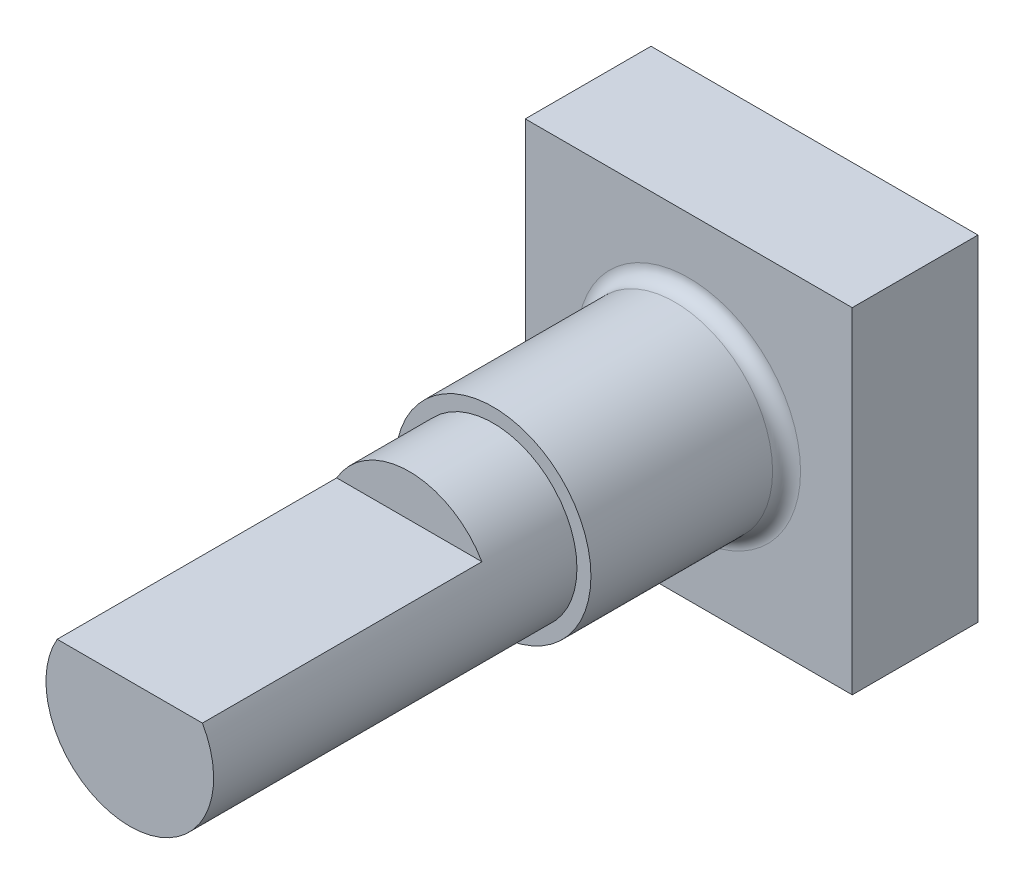
ISO-10303-21;
HEADER;
FILE_DESCRIPTION(('STEP AP214'),'2;1');
FILE_NAME('part.step','',(''),(''),'','','');
FILE_SCHEMA(('AUTOMOTIVE_DESIGN { 1 0 10303 214 1 1 1 1 }'));
ENDSEC;
DATA;
#1=APPLICATION_CONTEXT('core data for automotive mechanical design processes');
#2=APPLICATION_PROTOCOL_DEFINITION('international standard','automotive_design',2000,#1);
#3=PRODUCT_CONTEXT('',#1,'mechanical');
#4=PRODUCT('Part','Part','',(#3));
#5=PRODUCT_RELATED_PRODUCT_CATEGORY('part','',(#4));
#6=PRODUCT_DEFINITION_FORMATION('','',#4);
#7=PRODUCT_DEFINITION_CONTEXT('part definition',#1,'design');
#8=PRODUCT_DEFINITION('design','',#6,#7);
#9=PRODUCT_DEFINITION_SHAPE('','',#8);
#10=(LENGTH_UNIT() NAMED_UNIT(*) SI_UNIT(.MILLI.,.METRE.));
#11=(NAMED_UNIT(*) PLANE_ANGLE_UNIT() SI_UNIT($,.RADIAN.));
#12=(NAMED_UNIT(*) SI_UNIT($,.STERADIAN.) SOLID_ANGLE_UNIT());
#13=UNCERTAINTY_MEASURE_WITH_UNIT(LENGTH_MEASURE(1.E-05),#10,'distance_accuracy_value','');
#14=(GEOMETRIC_REPRESENTATION_CONTEXT(3) GLOBAL_UNCERTAINTY_ASSIGNED_CONTEXT((#13)) GLOBAL_UNIT_ASSIGNED_CONTEXT((#10,
#11,#12)) REPRESENTATION_CONTEXT('',''));
#15=CARTESIAN_POINT('',(0.,0.,0.));
#16=DIRECTION('',(0.,0.,1.));
#17=DIRECTION('',(1.,0.,0.));
#18=AXIS2_PLACEMENT_3D('',#15,#16,#17);
#19=CARTESIAN_POINT('',(0.,0.,4.5));
#20=DIRECTION('',(1.,0.,0.));
#21=DIRECTION('',(0.,1.,0.));
#22=AXIS2_PLACEMENT_3D('',#19,#20,#21);
#23=PLANE('',#22);
#24=DIRECTION('',(0.,-1.,0.));
#25=VECTOR('',#24,1.);
#26=CARTESIAN_POINT('',(0.,0.,0.));
#27=LINE('',#26,#25);
#28=CARTESIAN_POINT('',(0.,12.,0.));
#29=VERTEX_POINT('',#28);
#30=CARTESIAN_POINT('',(0.,0.,0.));
#31=VERTEX_POINT('',#30);
#32=EDGE_CURVE('E138',#29,#31,#27,.T.);
#33=ORIENTED_EDGE('',*,*,#32,.T.);
#34=DIRECTION('',(0.,0.,-1.));
#35=VECTOR('',#34,1.);
#36=CARTESIAN_POINT('',(0.,0.,4.5));
#37=LINE('',#36,#35);
#38=CARTESIAN_POINT('',(0.,0.,4.5));
#39=VERTEX_POINT('',#38);
#40=EDGE_CURVE('E134',#39,#31,#37,.T.);
#41=ORIENTED_EDGE('',*,*,#40,.F.);
#42=DIRECTION('',(0.,-1.,0.));
#43=VECTOR('',#42,1.);
#44=CARTESIAN_POINT('',(0.,0.,4.5));
#45=LINE('',#44,#43);
#46=CARTESIAN_POINT('',(0.,12.,4.5));
#47=VERTEX_POINT('',#46);
#48=EDGE_CURVE('E139',#47,#39,#45,.T.);
#49=ORIENTED_EDGE('',*,*,#48,.F.);
#50=DIRECTION('',(0.,0.,-1.));
#51=VECTOR('',#50,1.);
#52=CARTESIAN_POINT('',(0.,12.,4.5));
#53=LINE('',#52,#51);
#54=EDGE_CURVE('E149',#47,#29,#53,.T.);
#55=ORIENTED_EDGE('',*,*,#54,.T.);
#56=EDGE_LOOP('',(#33,#41,#49,#55));
#57=FACE_BOUND('',#56,.T.);
#58=ADVANCED_FACE('F39',(#57),#23,.F.);
#59=CARTESIAN_POINT('',(0.,0.,4.5));
#60=DIRECTION('',(0.,1.,0.));
#61=DIRECTION('',(0.,0.,1.));
#62=AXIS2_PLACEMENT_3D('',#59,#60,#61);
#63=PLANE('',#62);
#64=DIRECTION('',(1.,0.,0.));
#65=VECTOR('',#64,1.);
#66=CARTESIAN_POINT('',(0.,0.,0.));
#67=LINE('',#66,#65);
#68=CARTESIAN_POINT('',(11.7,0.,0.));
#69=VERTEX_POINT('',#68);
#70=EDGE_CURVE('E153',#31,#69,#67,.T.);
#71=ORIENTED_EDGE('',*,*,#70,.T.);
#72=DIRECTION('',(0.,0.,-1.));
#73=VECTOR('',#72,1.);
#74=CARTESIAN_POINT('',(11.7,0.,4.5));
#75=LINE('',#74,#73);
#76=CARTESIAN_POINT('',(11.7,0.,4.5));
#77=VERTEX_POINT('',#76);
#78=EDGE_CURVE('E166',#77,#69,#75,.T.);
#79=ORIENTED_EDGE('',*,*,#78,.F.);
#80=DIRECTION('',(1.,0.,0.));
#81=VECTOR('',#80,1.);
#82=CARTESIAN_POINT('',(0.,0.,4.5));
#83=LINE('',#82,#81);
#84=EDGE_CURVE('E93',#39,#77,#83,.T.);
#85=ORIENTED_EDGE('',*,*,#84,.F.);
#86=ORIENTED_EDGE('',*,*,#40,.T.);
#87=EDGE_LOOP('',(#71,#79,#85,#86));
#88=FACE_BOUND('',#87,.T.);
#89=ADVANCED_FACE('F186',(#88),#63,.F.);
#90=CARTESIAN_POINT('',(11.7,0.,4.5));
#91=DIRECTION('',(-1.,0.,0.));
#92=DIRECTION('',(0.,-1.,0.));
#93=AXIS2_PLACEMENT_3D('',#90,#91,#92);
#94=PLANE('',#93);
#95=DIRECTION('',(0.,1.,0.));
#96=VECTOR('',#95,1.);
#97=CARTESIAN_POINT('',(11.7,0.,0.));
#98=LINE('',#97,#96);
#99=CARTESIAN_POINT('',(11.7,12.,0.));
#100=VERTEX_POINT('',#99);
#101=EDGE_CURVE('E156',#69,#100,#98,.T.);
#102=ORIENTED_EDGE('',*,*,#101,.T.);
#103=DIRECTION('',(0.,0.,-1.));
#104=VECTOR('',#103,1.);
#105=CARTESIAN_POINT('',(11.7,12.,4.5));
#106=LINE('',#105,#104);
#107=CARTESIAN_POINT('',(11.7,12.,4.5));
#108=VERTEX_POINT('',#107);
#109=EDGE_CURVE('E163',#108,#100,#106,.T.);
#110=ORIENTED_EDGE('',*,*,#109,.F.);
#111=DIRECTION('',(0.,1.,0.));
#112=VECTOR('',#111,1.);
#113=CARTESIAN_POINT('',(11.7,0.,4.5));
#114=LINE('',#113,#112);
#115=EDGE_CURVE('E144',#77,#108,#114,.T.);
#116=ORIENTED_EDGE('',*,*,#115,.F.);
#117=ORIENTED_EDGE('',*,*,#78,.T.);
#118=EDGE_LOOP('',(#102,#110,#116,#117));
#119=FACE_BOUND('',#118,.T.);
#120=ADVANCED_FACE('F191',(#119),#94,.F.);
#121=CARTESIAN_POINT('',(0.,12.,4.5));
#122=DIRECTION('',(0.,-1.,0.));
#123=DIRECTION('',(0.,0.,-1.));
#124=AXIS2_PLACEMENT_3D('',#121,#122,#123);
#125=PLANE('',#124);
#126=DIRECTION('',(-1.,0.,0.));
#127=VECTOR('',#126,1.);
#128=CARTESIAN_POINT('',(0.,12.,0.));
#129=LINE('',#128,#127);
#130=EDGE_CURVE('E85',#100,#29,#129,.T.);
#131=ORIENTED_EDGE('',*,*,#130,.T.);
#132=ORIENTED_EDGE('',*,*,#54,.F.);
#133=DIRECTION('',(-1.,0.,0.));
#134=VECTOR('',#133,1.);
#135=CARTESIAN_POINT('',(0.,12.,4.5));
#136=LINE('',#135,#134);
#137=EDGE_CURVE('E64',#108,#47,#136,.T.);
#138=ORIENTED_EDGE('',*,*,#137,.F.);
#139=ORIENTED_EDGE('',*,*,#109,.T.);
#140=EDGE_LOOP('',(#131,#132,#138,#139));
#141=FACE_BOUND('',#140,.T.);
#142=ADVANCED_FACE('F196',(#141),#125,.F.);
#143=CARTESIAN_POINT('',(0.,0.,4.5));
#144=DIRECTION('',(0.,0.,-1.));
#145=DIRECTION('',(-1.,0.,0.));
#146=AXIS2_PLACEMENT_3D('',#143,#144,#145);
#147=PLANE('',#146);
#148=CARTESIAN_POINT('',(5.85,6.,4.5));
#149=DIRECTION('',(0.,0.,-1.));
#150=DIRECTION('',(-1.,0.,0.));
#151=AXIS2_PLACEMENT_3D('',#148,#149,#150);
#152=CIRCLE('',#151,4.);
#153=CARTESIAN_POINT('',(1.85,6.,4.5));
#154=VERTEX_POINT('',#153);
#155=EDGE_CURVE('E11',#154,#154,#152,.T.);
#156=ORIENTED_EDGE('',*,*,#155,.T.);
#157=EDGE_LOOP('',(#156));
#158=FACE_BOUND('',#157,.T.);
#159=ORIENTED_EDGE('',*,*,#48,.T.);
#160=ORIENTED_EDGE('',*,*,#84,.T.);
#161=ORIENTED_EDGE('',*,*,#115,.T.);
#162=ORIENTED_EDGE('',*,*,#137,.T.);
#163=EDGE_LOOP('',(#159,#160,#161,#162));
#164=FACE_BOUND('',#163,.T.);
#165=ADVANCED_FACE('F200',(#158,#164),#147,.F.);
#166=CARTESIAN_POINT('',(0.,0.,0.));
#167=DIRECTION('',(0.,0.,-1.));
#168=DIRECTION('',(-1.,0.,0.));
#169=AXIS2_PLACEMENT_3D('',#166,#167,#168);
#170=PLANE('',#169);
#171=ORIENTED_EDGE('',*,*,#32,.F.);
#172=ORIENTED_EDGE('',*,*,#130,.F.);
#173=ORIENTED_EDGE('',*,*,#101,.F.);
#174=ORIENTED_EDGE('',*,*,#70,.F.);
#175=EDGE_LOOP('',(#171,#172,#173,#174));
#176=FACE_BOUND('',#175,.T.);
#177=ADVANCED_FACE('F201',(#176),#170,.T.);
#178=CARTESIAN_POINT('',(5.85,6.,11.5));
#179=DIRECTION('',(0.,0.,-1.));
#180=DIRECTION('',(-1.,0.,0.));
#181=AXIS2_PLACEMENT_3D('',#178,#179,#180);
#182=CYLINDRICAL_SURFACE('',#181,3.5);
#183=CARTESIAN_POINT('',(5.85,6.,5.));
#184=DIRECTION('',(0.,0.,-1.));
#185=DIRECTION('',(-1.,0.,0.));
#186=AXIS2_PLACEMENT_3D('',#183,#184,#185);
#187=CIRCLE('',#186,3.5);
#188=CARTESIAN_POINT('',(2.35,6.,5.));
#189=VERTEX_POINT('',#188);
#190=EDGE_CURVE('E48',#189,#189,#187,.F.);
#191=ORIENTED_EDGE('',*,*,#190,.T.);
#192=EDGE_LOOP('',(#191));
#193=FACE_BOUND('',#192,.T.);
#194=CARTESIAN_POINT('',(5.85,6.,11.5));
#195=DIRECTION('',(0.,0.,1.));
#196=DIRECTION('',(1.,0.,0.));
#197=AXIS2_PLACEMENT_3D('',#194,#195,#196);
#198=CIRCLE('',#197,3.5);
#199=CARTESIAN_POINT('',(9.35,6.,11.5));
#200=VERTEX_POINT('',#199);
#201=EDGE_CURVE('E129',#200,#200,#198,.T.);
#202=ORIENTED_EDGE('',*,*,#201,.F.);
#203=EDGE_LOOP('',(#202));
#204=FACE_BOUND('',#203,.T.);
#205=ADVANCED_FACE('F175',(#193,#204),#182,.T.);
#206=CARTESIAN_POINT('',(5.85,6.,11.5));
#207=DIRECTION('',(0.,0.,1.));
#208=DIRECTION('',(1.,0.,0.));
#209=AXIS2_PLACEMENT_3D('',#206,#207,#208);
#210=PLANE('',#209);
#211=CARTESIAN_POINT('',(5.85,6.,11.5));
#212=DIRECTION('',(0.,0.,1.));
#213=DIRECTION('',(1.,0.,0.));
#214=AXIS2_PLACEMENT_3D('',#211,#212,#213);
#215=CIRCLE('',#214,3.);
#216=CARTESIAN_POINT('',(8.85,6.,11.5));
#217=VERTEX_POINT('',#216);
#218=EDGE_CURVE('E130',#217,#217,#215,.T.);
#219=ORIENTED_EDGE('',*,*,#218,.F.);
#220=EDGE_LOOP('',(#219));
#221=FACE_BOUND('',#220,.T.);
#222=ORIENTED_EDGE('',*,*,#201,.T.);
#223=EDGE_LOOP('',(#222));
#224=FACE_BOUND('',#223,.T.);
#225=ADVANCED_FACE('F210',(#221,#224),#210,.T.);
#226=CARTESIAN_POINT('',(5.85,6.,24.5));
#227=DIRECTION('',(0.,0.,-1.));
#228=DIRECTION('',(-1.,0.,0.));
#229=AXIS2_PLACEMENT_3D('',#226,#227,#228);
#230=CYLINDRICAL_SURFACE('',#229,3.);
#231=CARTESIAN_POINT('',(5.85,6.,24.5));
#232=DIRECTION('',(0.,0.,1.));
#233=DIRECTION('',(1.,0.,0.));
#234=AXIS2_PLACEMENT_3D('',#231,#232,#233);
#235=CIRCLE('',#234,3.);
#236=CARTESIAN_POINT('',(3.25192378864668,7.5,24.5));
#237=VERTEX_POINT('',#236);
#238=CARTESIAN_POINT('',(8.44807621135331,7.5,24.5));
#239=VERTEX_POINT('',#238);
#240=EDGE_CURVE('E120',#237,#239,#235,.T.);
#241=ORIENTED_EDGE('',*,*,#240,.F.);
#242=DIRECTION('',(0.,0.,1.));
#243=VECTOR('',#242,1.);
#244=CARTESIAN_POINT('',(3.25192378864668,7.5,14.5));
#245=LINE('',#244,#243);
#246=CARTESIAN_POINT('',(3.25192378864668,7.5,14.5));
#247=VERTEX_POINT('',#246);
#248=EDGE_CURVE('E55',#247,#237,#245,.T.);
#249=ORIENTED_EDGE('',*,*,#248,.F.);
#250=CARTESIAN_POINT('',(5.85,6.,14.5));
#251=DIRECTION('',(0.,0.,1.));
#252=DIRECTION('',(1.,0.,0.));
#253=AXIS2_PLACEMENT_3D('',#250,#251,#252);
#254=CIRCLE('',#253,3.);
#255=CARTESIAN_POINT('',(8.44807621135331,7.5,14.5));
#256=VERTEX_POINT('',#255);
#257=EDGE_CURVE('E104',#256,#247,#254,.T.);
#258=ORIENTED_EDGE('',*,*,#257,.F.);
#259=DIRECTION('',(0.,0.,1.));
#260=VECTOR('',#259,1.);
#261=CARTESIAN_POINT('',(8.44807621135331,7.5,14.5));
#262=LINE('',#261,#260);
#263=EDGE_CURVE('E113',#256,#239,#262,.T.);
#264=ORIENTED_EDGE('',*,*,#263,.T.);
#265=EDGE_LOOP('',(#241,#249,#258,#264));
#266=FACE_BOUND('',#265,.T.);
#267=ORIENTED_EDGE('',*,*,#218,.T.);
#268=EDGE_LOOP('',(#267));
#269=FACE_BOUND('',#268,.T.);
#270=ADVANCED_FACE('F117',(#266,#269),#230,.T.);
#271=CARTESIAN_POINT('',(5.85,6.,24.5));
#272=DIRECTION('',(0.,0.,1.));
#273=DIRECTION('',(1.,0.,0.));
#274=AXIS2_PLACEMENT_3D('',#271,#272,#273);
#275=PLANE('',#274);
#276=DIRECTION('',(1.,0.,0.));
#277=VECTOR('',#276,1.);
#278=CARTESIAN_POINT('',(3.25192378864668,7.5,24.5));
#279=LINE('',#278,#277);
#280=EDGE_CURVE('E110',#237,#239,#279,.T.);
#281=ORIENTED_EDGE('',*,*,#280,.F.);
#282=ORIENTED_EDGE('',*,*,#240,.T.);
#283=EDGE_LOOP('',(#281,#282));
#284=FACE_BOUND('',#283,.T.);
#285=ADVANCED_FACE('F216',(#284),#275,.T.);
#286=CARTESIAN_POINT('',(3.25192378864668,7.5,14.5));
#287=DIRECTION('',(0.,-1.,0.));
#288=DIRECTION('',(0.,0.,-1.));
#289=AXIS2_PLACEMENT_3D('',#286,#287,#288);
#290=PLANE('',#289);
#291=ORIENTED_EDGE('',*,*,#280,.T.);
#292=ORIENTED_EDGE('',*,*,#263,.F.);
#293=DIRECTION('',(1.,0.,0.));
#294=VECTOR('',#293,1.);
#295=CARTESIAN_POINT('',(3.25192378864668,7.5,14.5));
#296=LINE('',#295,#294);
#297=EDGE_CURVE('E106',#247,#256,#296,.T.);
#298=ORIENTED_EDGE('',*,*,#297,.F.);
#299=ORIENTED_EDGE('',*,*,#248,.T.);
#300=EDGE_LOOP('',(#291,#292,#298,#299));
#301=FACE_BOUND('',#300,.T.);
#302=ADVANCED_FACE('F112',(#301),#290,.F.);
#303=CARTESIAN_POINT('',(5.85,6.,14.5));
#304=DIRECTION('',(0.,0.,1.));
#305=DIRECTION('',(1.,0.,0.));
#306=AXIS2_PLACEMENT_3D('',#303,#304,#305);
#307=PLANE('',#306);
#308=ORIENTED_EDGE('',*,*,#257,.T.);
#309=ORIENTED_EDGE('',*,*,#297,.T.);
#310=EDGE_LOOP('',(#308,#309));
#311=FACE_BOUND('',#310,.T.);
#312=ADVANCED_FACE('F105',(#311),#307,.T.);
#313=CARTESIAN_POINT('',(5.85,6.,5.));
#314=DIRECTION('',(0.,0.,-1.));
#315=DIRECTION('',(-1.,0.,0.));
#316=AXIS2_PLACEMENT_3D('',#313,#314,#315);
#317=TOROIDAL_SURFACE('',#316,4.,0.5);
#318=ORIENTED_EDGE('',*,*,#155,.F.);
#319=EDGE_LOOP('',(#318));
#320=FACE_BOUND('',#319,.T.);
#321=ORIENTED_EDGE('',*,*,#190,.F.);
#322=EDGE_LOOP('',(#321));
#323=FACE_BOUND('',#322,.T.);
#324=ADVANCED_FACE('F41',(#320,#323),#317,.F.);
#325=CLOSED_SHELL('',(#58,#89,#120,#142,#165,#177,#205,#225,#270,#285,#302,#312,#324));
#326=MANIFOLD_SOLID_BREP('B2',#325);
#327=ADVANCED_BREP_SHAPE_REPRESENTATION('',(#18,#326),#14);
#328=SHAPE_DEFINITION_REPRESENTATION(#9,#327);
ENDSEC;
END-ISO-10303-21;
